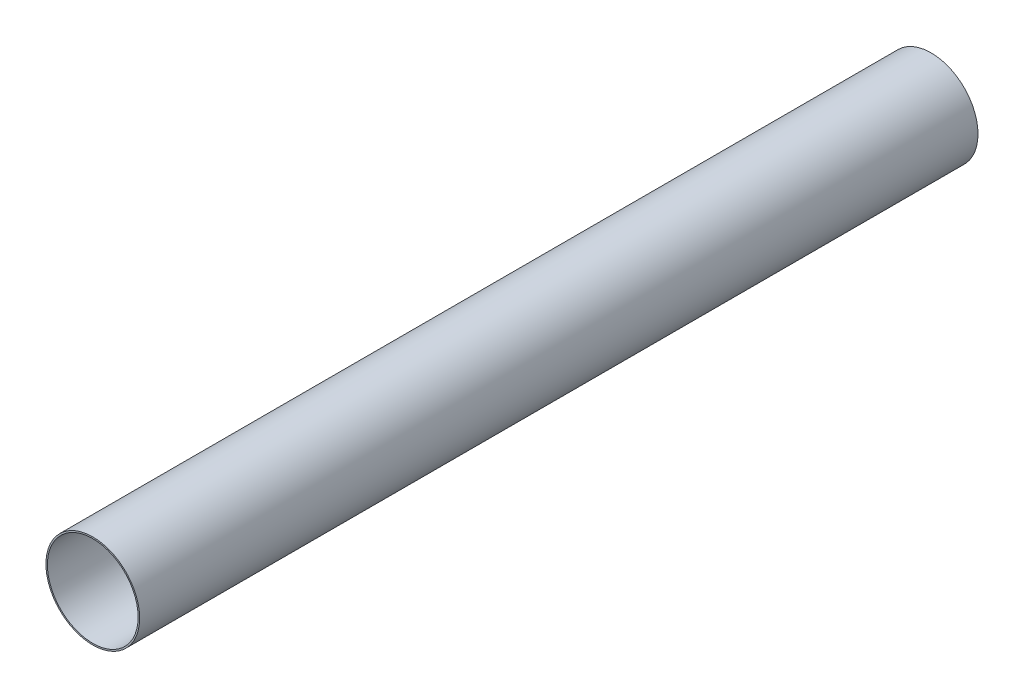
ISO-10303-21;
HEADER;
FILE_DESCRIPTION(('STEP AP214'),'2;1');
FILE_NAME('part.step','',(''),(''),'','','');
FILE_SCHEMA(('AUTOMOTIVE_DESIGN { 1 0 10303 214 1 1 1 1 }'));
ENDSEC;
DATA;
#1=APPLICATION_CONTEXT('core data for automotive mechanical design processes');
#2=APPLICATION_PROTOCOL_DEFINITION('international standard','automotive_design',2000,#1);
#3=PRODUCT_CONTEXT('',#1,'mechanical');
#4=PRODUCT('Part','Part','',(#3));
#5=PRODUCT_RELATED_PRODUCT_CATEGORY('part','',(#4));
#6=PRODUCT_DEFINITION_FORMATION('','',#4);
#7=PRODUCT_DEFINITION_CONTEXT('part definition',#1,'design');
#8=PRODUCT_DEFINITION('design','',#6,#7);
#9=PRODUCT_DEFINITION_SHAPE('','',#8);
#10=(LENGTH_UNIT() NAMED_UNIT(*) SI_UNIT(.MILLI.,.METRE.));
#11=(NAMED_UNIT(*) PLANE_ANGLE_UNIT() SI_UNIT($,.RADIAN.));
#12=(NAMED_UNIT(*) SI_UNIT($,.STERADIAN.) SOLID_ANGLE_UNIT());
#13=UNCERTAINTY_MEASURE_WITH_UNIT(LENGTH_MEASURE(1.E-05),#10,'distance_accuracy_value','');
#14=(GEOMETRIC_REPRESENTATION_CONTEXT(3) GLOBAL_UNCERTAINTY_ASSIGNED_CONTEXT((#13)) GLOBAL_UNIT_ASSIGNED_CONTEXT((#10,
#11,#12)) REPRESENTATION_CONTEXT('',''));
#15=CARTESIAN_POINT('',(0.,0.,0.));
#16=DIRECTION('',(0.,0.,1.));
#17=DIRECTION('',(1.,0.,0.));
#18=AXIS2_PLACEMENT_3D('',#15,#16,#17);
#19=CARTESIAN_POINT('',(0.,0.,680.));
#20=DIRECTION('',(0.,0.,1.));
#21=DIRECTION('',(1.,0.,0.));
#22=AXIS2_PLACEMENT_3D('',#19,#20,#21);
#23=PLANE('',#22);
#24=CARTESIAN_POINT('',(0.,0.,680.));
#25=DIRECTION('',(0.,0.,1.));
#26=DIRECTION('',(1.,0.,0.));
#27=AXIS2_PLACEMENT_3D('',#24,#25,#26);
#28=CIRCLE('',#27,38.);
#29=CARTESIAN_POINT('',(38.,0.,680.));
#30=VERTEX_POINT('',#29);
#31=EDGE_CURVE('E10',#30,#30,#28,.T.);
#32=ORIENTED_EDGE('',*,*,#31,.T.);
#33=EDGE_LOOP('',(#32));
#34=FACE_BOUND('',#33,.T.);
#35=CARTESIAN_POINT('',(0.,0.,680.));
#36=DIRECTION('',(0.,0.,1.));
#37=DIRECTION('',(1.,0.,0.));
#38=AXIS2_PLACEMENT_3D('',#35,#36,#37);
#39=CIRCLE('',#38,36.8);
#40=CARTESIAN_POINT('',(36.8,0.,680.));
#41=VERTEX_POINT('',#40);
#42=EDGE_CURVE('E42',#41,#41,#39,.T.);
#43=ORIENTED_EDGE('',*,*,#42,.F.);
#44=EDGE_LOOP('',(#43));
#45=FACE_BOUND('',#44,.T.);
#46=ADVANCED_FACE('F31',(#34,#45),#23,.T.);
#47=CARTESIAN_POINT('',(0.,0.,0.));
#48=DIRECTION('',(0.,0.,1.));
#49=DIRECTION('',(1.,0.,0.));
#50=AXIS2_PLACEMENT_3D('',#47,#48,#49);
#51=PLANE('',#50);
#52=CARTESIAN_POINT('',(0.,0.,0.));
#53=DIRECTION('',(0.,0.,1.));
#54=DIRECTION('',(1.,0.,0.));
#55=AXIS2_PLACEMENT_3D('',#52,#53,#54);
#56=CIRCLE('',#55,38.);
#57=CARTESIAN_POINT('',(38.,0.,0.));
#58=VERTEX_POINT('',#57);
#59=EDGE_CURVE('E35',#58,#58,#56,.T.);
#60=ORIENTED_EDGE('',*,*,#59,.F.);
#61=EDGE_LOOP('',(#60));
#62=FACE_BOUND('',#61,.T.);
#63=CARTESIAN_POINT('',(0.,0.,0.));
#64=DIRECTION('',(0.,0.,1.));
#65=DIRECTION('',(1.,0.,0.));
#66=AXIS2_PLACEMENT_3D('',#63,#64,#65);
#67=CIRCLE('',#66,36.8);
#68=CARTESIAN_POINT('',(36.8,0.,0.));
#69=VERTEX_POINT('',#68);
#70=EDGE_CURVE('E44',#69,#69,#67,.T.);
#71=ORIENTED_EDGE('',*,*,#70,.T.);
#72=EDGE_LOOP('',(#71));
#73=FACE_BOUND('',#72,.T.);
#74=ADVANCED_FACE('F54',(#62,#73),#51,.F.);
#75=CARTESIAN_POINT('',(0.,0.,680.));
#76=DIRECTION('',(0.,0.,-1.));
#77=DIRECTION('',(-1.,0.,0.));
#78=AXIS2_PLACEMENT_3D('',#75,#76,#77);
#79=CYLINDRICAL_SURFACE('',#78,38.);
#80=ORIENTED_EDGE('',*,*,#31,.F.);
#81=EDGE_LOOP('',(#80));
#82=FACE_BOUND('',#81,.T.);
#83=ORIENTED_EDGE('',*,*,#59,.T.);
#84=EDGE_LOOP('',(#83));
#85=FACE_BOUND('',#84,.T.);
#86=ADVANCED_FACE('F33',(#82,#85),#79,.T.);
#87=CARTESIAN_POINT('',(0.,0.,680.));
#88=DIRECTION('',(0.,0.,-1.));
#89=DIRECTION('',(-1.,0.,0.));
#90=AXIS2_PLACEMENT_3D('',#87,#88,#89);
#91=CYLINDRICAL_SURFACE('',#90,36.8);
#92=ORIENTED_EDGE('',*,*,#42,.T.);
#93=EDGE_LOOP('',(#92));
#94=FACE_BOUND('',#93,.T.);
#95=ORIENTED_EDGE('',*,*,#70,.F.);
#96=EDGE_LOOP('',(#95));
#97=FACE_BOUND('',#96,.T.);
#98=ADVANCED_FACE('F50',(#94,#97),#91,.F.);
#99=CLOSED_SHELL('',(#46,#74,#86,#98));
#100=MANIFOLD_SOLID_BREP('B2',#99);
#101=ADVANCED_BREP_SHAPE_REPRESENTATION('',(#18,#100),#14);
#102=SHAPE_DEFINITION_REPRESENTATION(#9,#101);
ENDSEC;
END-ISO-10303-21;
